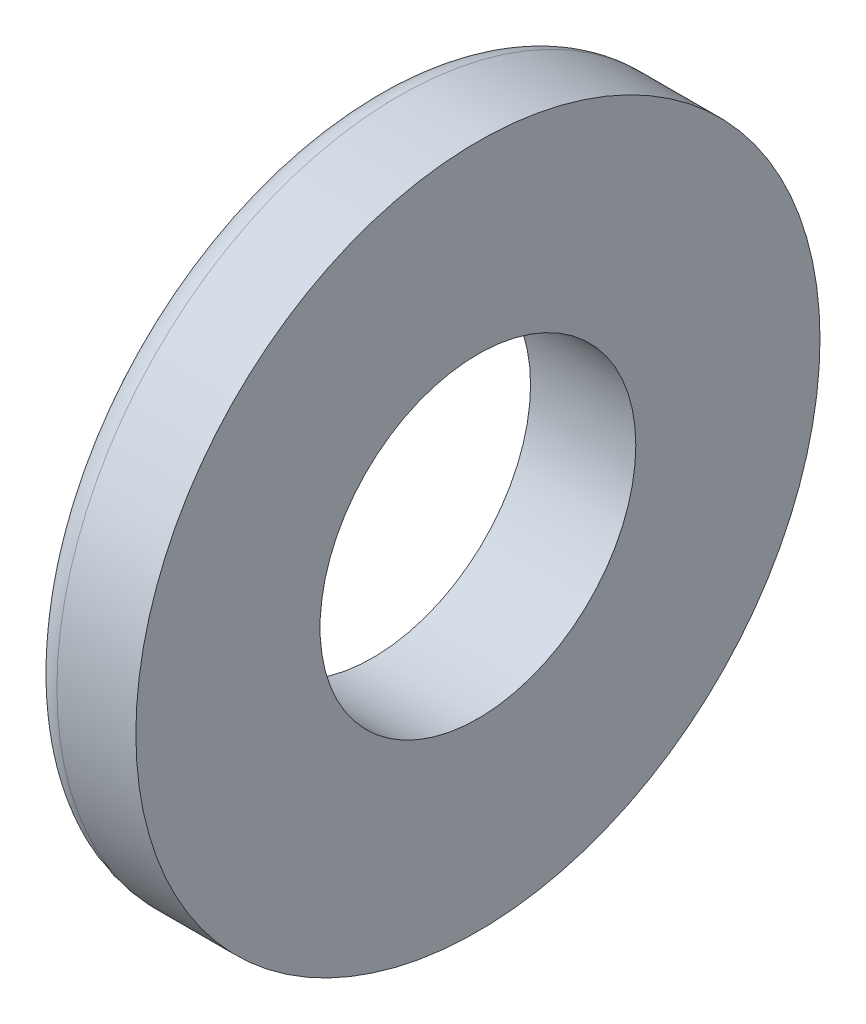
ISO-10303-21;
HEADER;
FILE_DESCRIPTION(('STEP AP214'),'2;1');
FILE_NAME('part.step','',(''),(''),'','','');
FILE_SCHEMA(('AUTOMOTIVE_DESIGN { 1 0 10303 214 1 1 1 1 }'));
ENDSEC;
DATA;
#1=APPLICATION_CONTEXT('core data for automotive mechanical design processes');
#2=APPLICATION_PROTOCOL_DEFINITION('international standard','automotive_design',2000,#1);
#3=PRODUCT_CONTEXT('',#1,'mechanical');
#4=PRODUCT('Part','Part','',(#3));
#5=PRODUCT_RELATED_PRODUCT_CATEGORY('part','',(#4));
#6=PRODUCT_DEFINITION_FORMATION('','',#4);
#7=PRODUCT_DEFINITION_CONTEXT('part definition',#1,'design');
#8=PRODUCT_DEFINITION('design','',#6,#7);
#9=PRODUCT_DEFINITION_SHAPE('','',#8);
#10=(LENGTH_UNIT() NAMED_UNIT(*) SI_UNIT(.MILLI.,.METRE.));
#11=(NAMED_UNIT(*) PLANE_ANGLE_UNIT() SI_UNIT($,.RADIAN.));
#12=(NAMED_UNIT(*) SI_UNIT($,.STERADIAN.) SOLID_ANGLE_UNIT());
#13=UNCERTAINTY_MEASURE_WITH_UNIT(LENGTH_MEASURE(1.E-05),#10,'distance_accuracy_value','');
#14=(GEOMETRIC_REPRESENTATION_CONTEXT(3) GLOBAL_UNCERTAINTY_ASSIGNED_CONTEXT((#13)) GLOBAL_UNIT_ASSIGNED_CONTEXT((#10,
#11,#12)) REPRESENTATION_CONTEXT('',''));
#15=CARTESIAN_POINT('',(0.,0.,0.));
#16=DIRECTION('',(0.,0.,1.));
#17=DIRECTION('',(1.,0.,0.));
#18=AXIS2_PLACEMENT_3D('',#15,#16,#17);
#19=CARTESIAN_POINT('',(2.,0.,0.));
#20=DIRECTION('',(1.,0.,0.));
#21=DIRECTION('',(0.,0.,-1.));
#22=AXIS2_PLACEMENT_3D('',#19,#20,#21);
#23=PLANE('',#22);
#24=CARTESIAN_POINT('',(2.,0.,0.));
#25=DIRECTION('',(1.,0.,0.));
#26=DIRECTION('',(0.,0.,-1.));
#27=AXIS2_PLACEMENT_3D('',#24,#25,#26);
#28=CIRCLE('',#27,6.5);
#29=CARTESIAN_POINT('',(2.,0.,-6.5));
#30=VERTEX_POINT('',#29);
#31=EDGE_CURVE('E47',#30,#30,#28,.T.);
#32=ORIENTED_EDGE('',*,*,#31,.T.);
#33=EDGE_LOOP('',(#32));
#34=FACE_BOUND('',#33,.T.);
#35=CARTESIAN_POINT('',(2.,0.,0.));
#36=DIRECTION('',(1.,0.,0.));
#37=DIRECTION('',(0.,0.,-1.));
#38=AXIS2_PLACEMENT_3D('',#35,#36,#37);
#39=CIRCLE('',#38,3.);
#40=CARTESIAN_POINT('',(2.,0.,-3.));
#41=VERTEX_POINT('',#40);
#42=EDGE_CURVE('E51',#41,#41,#39,.T.);
#43=ORIENTED_EDGE('',*,*,#42,.F.);
#44=EDGE_LOOP('',(#43));
#45=FACE_BOUND('',#44,.T.);
#46=ADVANCED_FACE('F36',(#34,#45),#23,.T.);
#47=CARTESIAN_POINT('',(0.,0.,0.));
#48=DIRECTION('',(1.,0.,0.));
#49=DIRECTION('',(0.,0.,-1.));
#50=AXIS2_PLACEMENT_3D('',#47,#48,#49);
#51=PLANE('',#50);
#52=CARTESIAN_POINT('',(0.,0.,0.));
#53=DIRECTION('',(1.,0.,0.));
#54=DIRECTION('',(0.,0.,-1.));
#55=AXIS2_PLACEMENT_3D('',#52,#53,#54);
#56=CIRCLE('',#55,6.);
#57=CARTESIAN_POINT('',(0.,0.,-6.));
#58=VERTEX_POINT('',#57);
#59=EDGE_CURVE('E10',#58,#58,#56,.F.);
#60=ORIENTED_EDGE('',*,*,#59,.T.);
#61=EDGE_LOOP('',(#60));
#62=FACE_BOUND('',#61,.T.);
#63=CARTESIAN_POINT('',(0.,0.,0.));
#64=DIRECTION('',(1.,0.,0.));
#65=DIRECTION('',(0.,0.,-1.));
#66=AXIS2_PLACEMENT_3D('',#63,#64,#65);
#67=CIRCLE('',#66,3.);
#68=CARTESIAN_POINT('',(0.,0.,-3.));
#69=VERTEX_POINT('',#68);
#70=EDGE_CURVE('E54',#69,#69,#67,.T.);
#71=ORIENTED_EDGE('',*,*,#70,.T.);
#72=EDGE_LOOP('',(#71));
#73=FACE_BOUND('',#72,.T.);
#74=ADVANCED_FACE('F64',(#62,#73),#51,.F.);
#75=CARTESIAN_POINT('',(2.,0.,0.));
#76=DIRECTION('',(-1.,0.,0.));
#77=DIRECTION('',(0.,0.,1.));
#78=AXIS2_PLACEMENT_3D('',#75,#76,#77);
#79=CYLINDRICAL_SURFACE('',#78,6.5);
#80=CARTESIAN_POINT('',(0.5,0.,0.));
#81=DIRECTION('',(1.,0.,0.));
#82=DIRECTION('',(0.,0.,-1.));
#83=AXIS2_PLACEMENT_3D('',#80,#81,#82);
#84=CIRCLE('',#83,6.5);
#85=CARTESIAN_POINT('',(0.5,0.,-6.5));
#86=VERTEX_POINT('',#85);
#87=EDGE_CURVE('E43',#86,#86,#84,.T.);
#88=ORIENTED_EDGE('',*,*,#87,.T.);
#89=EDGE_LOOP('',(#88));
#90=FACE_BOUND('',#89,.T.);
#91=ORIENTED_EDGE('',*,*,#31,.F.);
#92=EDGE_LOOP('',(#91));
#93=FACE_BOUND('',#92,.T.);
#94=ADVANCED_FACE('F70',(#90,#93),#79,.T.);
#95=CARTESIAN_POINT('',(2.,0.,0.));
#96=DIRECTION('',(-1.,0.,0.));
#97=DIRECTION('',(0.,0.,1.));
#98=AXIS2_PLACEMENT_3D('',#95,#96,#97);
#99=CYLINDRICAL_SURFACE('',#98,3.);
#100=ORIENTED_EDGE('',*,*,#42,.T.);
#101=EDGE_LOOP('',(#100));
#102=FACE_BOUND('',#101,.T.);
#103=ORIENTED_EDGE('',*,*,#70,.F.);
#104=EDGE_LOOP('',(#103));
#105=FACE_BOUND('',#104,.T.);
#106=ADVANCED_FACE('F60',(#102,#105),#99,.F.);
#107=CARTESIAN_POINT('',(0.5,0.,0.));
#108=DIRECTION('',(1.,0.,0.));
#109=DIRECTION('',(0.,0.,-1.));
#110=AXIS2_PLACEMENT_3D('',#107,#108,#109);
#111=TOROIDAL_SURFACE('',#110,6.,0.5);
#112=ORIENTED_EDGE('',*,*,#59,.F.);
#113=EDGE_LOOP('',(#112));
#114=FACE_BOUND('',#113,.T.);
#115=ORIENTED_EDGE('',*,*,#87,.F.);
#116=EDGE_LOOP('',(#115));
#117=FACE_BOUND('',#116,.T.);
#118=ADVANCED_FACE('F38',(#114,#117),#111,.T.);
#119=CLOSED_SHELL('',(#46,#74,#94,#106,#118));
#120=MANIFOLD_SOLID_BREP('B2',#119);
#121=ADVANCED_BREP_SHAPE_REPRESENTATION('',(#18,#120),#14);
#122=SHAPE_DEFINITION_REPRESENTATION(#9,#121);
ENDSEC;
END-ISO-10303-21;
